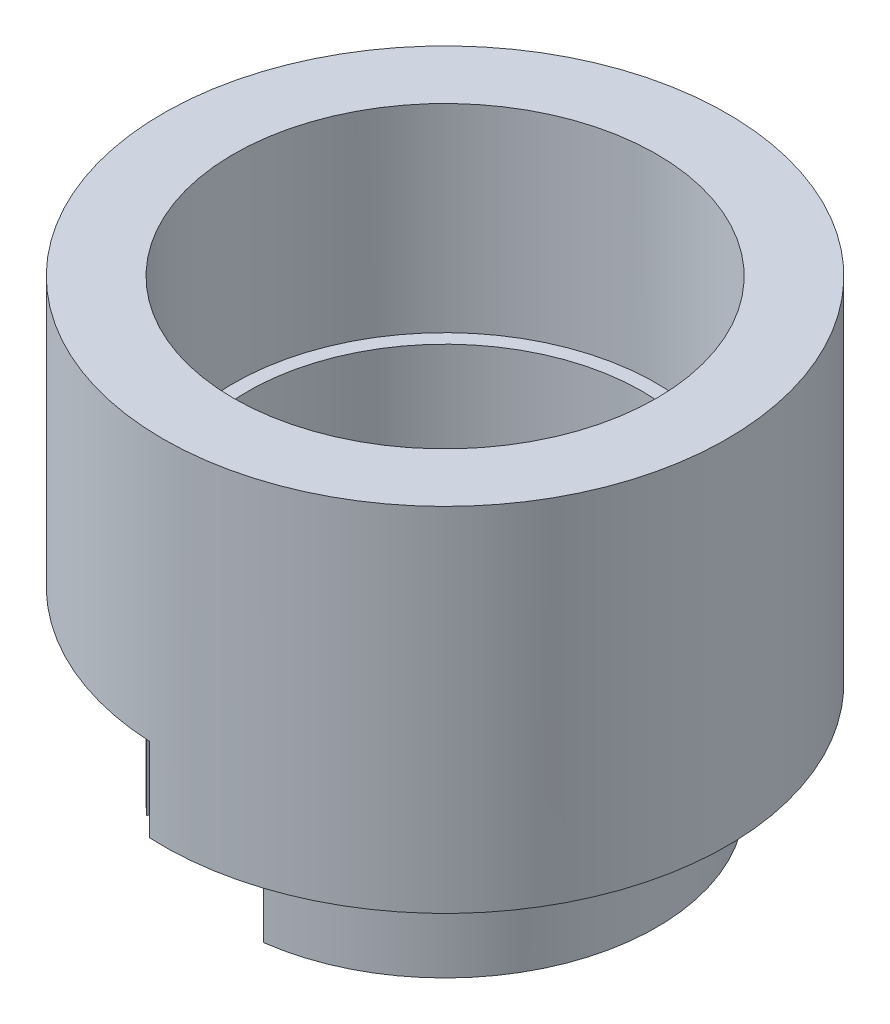
ISO-10303-21;
HEADER;
FILE_DESCRIPTION(('STEP AP214'),'2;1');
FILE_NAME('part.step','',(''),(''),'','','');
FILE_SCHEMA(('AUTOMOTIVE_DESIGN { 1 0 10303 214 1 1 1 1 }'));
ENDSEC;
DATA;
#1=APPLICATION_CONTEXT('core data for automotive mechanical design processes');
#2=APPLICATION_PROTOCOL_DEFINITION('international standard','automotive_design',2000,#1);
#3=PRODUCT_CONTEXT('',#1,'mechanical');
#4=PRODUCT('Part','Part','',(#3));
#5=PRODUCT_RELATED_PRODUCT_CATEGORY('part','',(#4));
#6=PRODUCT_DEFINITION_FORMATION('','',#4);
#7=PRODUCT_DEFINITION_CONTEXT('part definition',#1,'design');
#8=PRODUCT_DEFINITION('design','',#6,#7);
#9=PRODUCT_DEFINITION_SHAPE('','',#8);
#10=(LENGTH_UNIT() NAMED_UNIT(*) SI_UNIT(.MILLI.,.METRE.));
#11=(NAMED_UNIT(*) PLANE_ANGLE_UNIT() SI_UNIT($,.RADIAN.));
#12=(NAMED_UNIT(*) SI_UNIT($,.STERADIAN.) SOLID_ANGLE_UNIT());
#13=UNCERTAINTY_MEASURE_WITH_UNIT(LENGTH_MEASURE(1.E-05),#10,'distance_accuracy_value','');
#14=(GEOMETRIC_REPRESENTATION_CONTEXT(3) GLOBAL_UNCERTAINTY_ASSIGNED_CONTEXT((#13)) GLOBAL_UNIT_ASSIGNED_CONTEXT((#10,
#11,#12)) REPRESENTATION_CONTEXT('',''));
#15=CARTESIAN_POINT('',(0.,0.,0.));
#16=DIRECTION('',(0.,0.,1.));
#17=DIRECTION('',(1.,0.,0.));
#18=AXIS2_PLACEMENT_3D('',#15,#16,#17);
#19=CARTESIAN_POINT('',(0.,0.,0.));
#20=DIRECTION('',(0.,1.,0.));
#21=DIRECTION('',(0.,0.,1.));
#22=AXIS2_PLACEMENT_3D('',#19,#20,#21);
#23=PLANE('',#22);
#24=CARTESIAN_POINT('',(-21.1602690825293,0.,-29.1246117974979));
#25=DIRECTION('',(0.,-1.,0.));
#26=DIRECTION('',(0.,0.,-1.));
#27=AXIS2_PLACEMENT_3D('',#24,#25,#26);
#28=CIRCLE('',#27,1.5);
#29=CARTESIAN_POINT('',(-21.1602690825293,0.,-30.6246117974979));
#30=VERTEX_POINT('',#29);
#31=EDGE_CURVE('E253',#30,#30,#28,.T.);
#32=ORIENTED_EDGE('',*,*,#31,.F.);
#33=EDGE_LOOP('',(#32));
#34=FACE_BOUND('',#33,.T.);
#35=CARTESIAN_POINT('',(-34.2380345866256,0.,-11.1246117974978));
#36=DIRECTION('',(0.,-1.,0.));
#37=DIRECTION('',(0.,0.,-1.));
#38=AXIS2_PLACEMENT_3D('',#35,#36,#37);
#39=CIRCLE('',#38,1.5);
#40=CARTESIAN_POINT('',(-34.2380345866256,0.,-12.6246117974978));
#41=VERTEX_POINT('',#40);
#42=EDGE_CURVE('E236',#41,#41,#39,.T.);
#43=ORIENTED_EDGE('',*,*,#42,.F.);
#44=EDGE_LOOP('',(#43));
#45=FACE_BOUND('',#44,.T.);
#46=CARTESIAN_POINT('',(-34.2380345866254,0.,11.1246117974985));
#47=DIRECTION('',(0.,-1.,0.));
#48=DIRECTION('',(0.,0.,-1.));
#49=AXIS2_PLACEMENT_3D('',#46,#47,#48);
#50=CIRCLE('',#49,1.5);
#51=CARTESIAN_POINT('',(-34.2380345866254,0.,9.62461179749849));
#52=VERTEX_POINT('',#51);
#53=EDGE_CURVE('E207',#52,#52,#50,.T.);
#54=ORIENTED_EDGE('',*,*,#53,.F.);
#55=EDGE_LOOP('',(#54));
#56=FACE_BOUND('',#55,.T.);
#57=DIRECTION('',(-0.819178042205052,0.,0.573539305688021));
#58=VECTOR('',#57,1.);
#59=CARTESIAN_POINT('',(-3.81627640035369,0.,-5.45073336587605));
#60=LINE('',#59,#58);
#61=CARTESIAN_POINT('',(-30.2939246678071,0.,13.0873270082637));
#62=VERTEX_POINT('',#61);
#63=CARTESIAN_POINT('',(-36.126859333869,0.,17.1711978228324));
#64=VERTEX_POINT('',#63);
#65=EDGE_CURVE('E172',#62,#64,#60,.T.);
#66=ORIENTED_EDGE('',*,*,#65,.T.);
#67=CARTESIAN_POINT('',(0.,0.,0.));
#68=DIRECTION('',(0.,1.,0.));
#69=DIRECTION('',(0.,0.,1.));
#70=AXIS2_PLACEMENT_3D('',#67,#68,#69);
#71=CIRCLE('',#70,40.);
#72=CARTESIAN_POINT('',(-19.5058879135128,0.,-34.9216313580204));
#73=VERTEX_POINT('',#72);
#74=EDGE_CURVE('E42',#73,#64,#71,.T.);
#75=ORIENTED_EDGE('',*,*,#74,.F.);
#76=DIRECTION('',(-0.487647197837817,0.,-0.873040783950512));
#77=VECTOR('',#76,1.);
#78=CARTESIAN_POINT('',(-1.40847043936586E-13,0.,0.));
#79=LINE('',#78,#77);
#80=CARTESIAN_POINT('',(-16.0923575286481,0.,-28.8103458703668));
#81=VERTEX_POINT('',#80);
#82=EDGE_CURVE('E199',#81,#73,#79,.T.);
#83=ORIENTED_EDGE('',*,*,#82,.F.);
#84=CARTESIAN_POINT('',(0.,0.,0.));
#85=DIRECTION('',(0.,-1.,0.));
#86=DIRECTION('',(0.,0.,-1.));
#87=AXIS2_PLACEMENT_3D('',#84,#85,#86);
#88=CIRCLE('',#87,33.);
#89=EDGE_CURVE('E196',#62,#81,#88,.T.);
#90=ORIENTED_EDGE('',*,*,#89,.F.);
#91=EDGE_LOOP('',(#66,#75,#83,#90));
#92=FACE_BOUND('',#91,.T.);
#93=ADVANCED_FACE('F33',(#34,#45,#56,#92),#23,.F.);
#94=CARTESIAN_POINT('',(0.,50.,0.));
#95=DIRECTION('',(0.,-1.,0.));
#96=DIRECTION('',(0.,0.,-1.));
#97=AXIS2_PLACEMENT_3D('',#94,#95,#96);
#98=CYLINDRICAL_SURFACE('',#97,40.);
#99=CARTESIAN_POINT('',(0.,50.,0.));
#100=DIRECTION('',(0.,1.,0.));
#101=DIRECTION('',(0.,0.,1.));
#102=AXIS2_PLACEMENT_3D('',#99,#100,#101);
#103=CIRCLE('',#102,40.);
#104=CARTESIAN_POINT('',(0.,50.,40.));
#105=VERTEX_POINT('',#104);
#106=EDGE_CURVE('E11',#105,#105,#103,.T.);
#107=ORIENTED_EDGE('',*,*,#106,.F.);
#108=EDGE_LOOP('',(#107));
#109=FACE_BOUND('',#108,.T.);
#110=DIRECTION('',(0.,-1.,0.));
#111=VECTOR('',#110,1.);
#112=CARTESIAN_POINT('',(-36.126859333869,11.84997677,17.1711978228324));
#113=LINE('',#112,#111);
#114=CARTESIAN_POINT('',(-36.126859333869,11.84997677,17.1711978228324));
#115=VERTEX_POINT('',#114);
#116=EDGE_CURVE('E205',#115,#64,#113,.T.);
#117=ORIENTED_EDGE('',*,*,#116,.F.);
#118=CARTESIAN_POINT('',(0.,11.84997677,0.));
#119=DIRECTION('',(0.,-1.,0.));
#120=DIRECTION('',(0.,0.,-1.));
#121=AXIS2_PLACEMENT_3D('',#118,#119,#120);
#122=CIRCLE('',#121,40.);
#123=CARTESIAN_POINT('',(-1.9505371321681,11.84997677,39.9524142561627));
#124=VERTEX_POINT('',#123);
#125=EDGE_CURVE('E186',#124,#115,#122,.T.);
#126=ORIENTED_EDGE('',*,*,#125,.F.);
#127=DIRECTION('',(0.,-1.,0.));
#128=VECTOR('',#127,1.);
#129=CARTESIAN_POINT('',(-1.9505371321681,11.84997677,39.9524142561627));
#130=LINE('',#129,#128);
#131=CARTESIAN_POINT('',(-1.9505371321681,0.,39.9524142561627));
#132=VERTEX_POINT('',#131);
#133=EDGE_CURVE('E208',#124,#132,#130,.T.);
#134=ORIENTED_EDGE('',*,*,#133,.T.);
#135=CARTESIAN_POINT('',(4.19737007297038,0.,-39.7791664627419));
#136=VERTEX_POINT('',#135);
#137=EDGE_CURVE('E37',#132,#136,#71,.T.);
#138=ORIENTED_EDGE('',*,*,#137,.T.);
#139=DIRECTION('',(0.,-1.,0.));
#140=VECTOR('',#139,1.);
#141=CARTESIAN_POINT('',(4.19737007297038,11.84997677,-39.7791664627419));
#142=LINE('',#141,#140);
#143=CARTESIAN_POINT('',(4.19737007297038,11.84997677,-39.7791664627419));
#144=VERTEX_POINT('',#143);
#145=EDGE_CURVE('E216',#144,#136,#142,.T.);
#146=ORIENTED_EDGE('',*,*,#145,.F.);
#147=CARTESIAN_POINT('',(-19.5058879135128,11.84997677,-34.9216313580204));
#148=VERTEX_POINT('',#147);
#149=EDGE_CURVE('E182',#148,#144,#122,.T.);
#150=ORIENTED_EDGE('',*,*,#149,.F.);
#151=DIRECTION('',(0.,-1.,0.));
#152=VECTOR('',#151,1.);
#153=CARTESIAN_POINT('',(-19.5058879135128,11.84997677,-34.9216313580204));
#154=LINE('',#153,#152);
#155=EDGE_CURVE('E218',#148,#73,#154,.T.);
#156=ORIENTED_EDGE('',*,*,#155,.T.);
#157=ORIENTED_EDGE('',*,*,#74,.T.);
#158=EDGE_LOOP('',(#117,#126,#134,#138,#146,#150,#156,#157));
#159=FACE_BOUND('',#158,.T.);
#160=ADVANCED_FACE('F35',(#109,#159),#98,.T.);
#161=CARTESIAN_POINT('',(0.,50.,0.));
#162=DIRECTION('',(0.,1.,0.));
#163=DIRECTION('',(0.,0.,1.));
#164=AXIS2_PLACEMENT_3D('',#161,#162,#163);
#165=PLANE('',#164);
#166=ORIENTED_EDGE('',*,*,#106,.T.);
#167=EDGE_LOOP('',(#166));
#168=FACE_BOUND('',#167,.T.);
#169=CARTESIAN_POINT('',(0.,50.,0.));
#170=DIRECTION('',(0.,1.,0.));
#171=DIRECTION('',(0.,0.,1.));
#172=AXIS2_PLACEMENT_3D('',#169,#170,#171);
#173=CIRCLE('',#172,30.);
#174=CARTESIAN_POINT('',(0.,50.,30.));
#175=VERTEX_POINT('',#174);
#176=EDGE_CURVE('E261',#175,#175,#173,.T.);
#177=ORIENTED_EDGE('',*,*,#176,.F.);
#178=EDGE_LOOP('',(#177));
#179=FACE_BOUND('',#178,.T.);
#180=ADVANCED_FACE('F296',(#168,#179),#165,.T.);
#181=CARTESIAN_POINT('',(21.1602690825291,0.,29.1246117974981));
#182=DIRECTION('',(0.,-1.,0.));
#183=DIRECTION('',(0.,0.,-1.));
#184=AXIS2_PLACEMENT_3D('',#181,#182,#183);
#185=CIRCLE('',#184,1.5);
#186=CARTESIAN_POINT('',(21.1602690825291,0.,27.6246117974981));
#187=VERTEX_POINT('',#186);
#188=EDGE_CURVE('E229',#187,#187,#185,.T.);
#189=ORIENTED_EDGE('',*,*,#188,.F.);
#190=EDGE_LOOP('',(#189));
#191=FACE_BOUND('',#190,.T.);
#192=CARTESIAN_POINT('',(34.2380345866255,0.,-11.1246117974983));
#193=DIRECTION('',(0.,-1.,0.));
#194=DIRECTION('',(0.,0.,-1.));
#195=AXIS2_PLACEMENT_3D('',#192,#193,#194);
#196=CIRCLE('',#195,1.5);
#197=CARTESIAN_POINT('',(34.2380345866255,0.,-12.6246117974983));
#198=VERTEX_POINT('',#197);
#199=EDGE_CURVE('E247',#198,#198,#196,.T.);
#200=ORIENTED_EDGE('',*,*,#199,.F.);
#201=EDGE_LOOP('',(#200));
#202=FACE_BOUND('',#201,.T.);
#203=CARTESIAN_POINT('',(34.2380345866256,0.,11.124611797498));
#204=DIRECTION('',(0.,-1.,0.));
#205=DIRECTION('',(0.,0.,-1.));
#206=AXIS2_PLACEMENT_3D('',#203,#204,#205);
#207=CIRCLE('',#206,1.5);
#208=CARTESIAN_POINT('',(34.2380345866256,0.,9.62461179749802));
#209=VERTEX_POINT('',#208);
#210=EDGE_CURVE('E241',#209,#209,#207,.T.);
#211=ORIENTED_EDGE('',*,*,#210,.F.);
#212=EDGE_LOOP('',(#211));
#213=FACE_BOUND('',#212,.T.);
#214=ORIENTED_EDGE('',*,*,#137,.F.);
#215=DIRECTION('',(-0.0487634283041756,0.,0.998810356404069));
#216=VECTOR('',#215,1.);
#217=CARTESIAN_POINT('',(-1.07793096146607E-12,0.,0.));
#218=LINE('',#217,#216);
#219=CARTESIAN_POINT('',(-1.46290284912635,0.,29.964310692122));
#220=VERTEX_POINT('',#219);
#221=EDGE_CURVE('E176',#220,#132,#218,.T.);
#222=ORIENTED_EDGE('',*,*,#221,.F.);
#223=CARTESIAN_POINT('',(0.,0.,0.));
#224=DIRECTION('',(0.,1.,0.));
#225=DIRECTION('',(0.,0.,1.));
#226=AXIS2_PLACEMENT_3D('',#223,#224,#225);
#227=CIRCLE('',#226,30.);
#228=CARTESIAN_POINT('',(4.00883862894171,0.,29.7309470560072));
#229=VERTEX_POINT('',#228);
#230=EDGE_CURVE('E228',#220,#229,#227,.T.);
#231=ORIENTED_EDGE('',*,*,#230,.T.);
#232=CARTESIAN_POINT('',(0.,0.,0.));
#233=DIRECTION('',(0.,1.,0.));
#234=DIRECTION('',(0.,0.,1.));
#235=AXIS2_PLACEMENT_3D('',#232,#233,#234);
#236=CIRCLE('',#235,30.);
#237=CARTESIAN_POINT('',(3.14802755472722,0.,-29.8343748470565));
#238=VERTEX_POINT('',#237);
#239=EDGE_CURVE('E166',#229,#238,#236,.T.);
#240=ORIENTED_EDGE('',*,*,#239,.T.);
#241=DIRECTION('',(0.104934251824316,0.,-0.994479161568542));
#242=VECTOR('',#241,1.);
#243=CARTESIAN_POINT('',(-2.26511715484874E-12,0.,-2.39007897926772E-13));
#244=LINE('',#243,#242);
#245=EDGE_CURVE('E201',#238,#136,#244,.T.);
#246=ORIENTED_EDGE('',*,*,#245,.T.);
#247=EDGE_LOOP('',(#214,#222,#231,#240,#246));
#248=FACE_BOUND('',#247,.T.);
#249=ADVANCED_FACE('F270',(#191,#202,#213,#248),#23,.F.);
#250=CARTESIAN_POINT('',(0.,50.,0.));
#251=DIRECTION('',(0.,-1.,0.));
#252=DIRECTION('',(0.,0.,-1.));
#253=AXIS2_PLACEMENT_3D('',#250,#251,#252);
#254=CYLINDRICAL_SURFACE('',#253,30.);
#255=DIRECTION('',(0.,-1.,0.));
#256=VECTOR('',#255,1.);
#257=CARTESIAN_POINT('',(4.0088386289417,21.84997677,29.7309470560072));
#258=LINE('',#257,#256);
#259=CARTESIAN_POINT('',(4.00883862894171,21.84997677,29.7309470560072));
#260=VERTEX_POINT('',#259);
#261=EDGE_CURVE('E167',#260,#229,#258,.T.);
#262=ORIENTED_EDGE('',*,*,#261,.T.);
#263=ORIENTED_EDGE('',*,*,#230,.F.);
#264=DIRECTION('',(0.,-1.,0.));
#265=VECTOR('',#264,1.);
#266=CARTESIAN_POINT('',(-1.46290284912635,11.84997677,29.964310692122));
#267=LINE('',#266,#265);
#268=CARTESIAN_POINT('',(-1.46290284912635,11.84997677,29.964310692122));
#269=VERTEX_POINT('',#268);
#270=EDGE_CURVE('E211',#269,#220,#267,.T.);
#271=ORIENTED_EDGE('',*,*,#270,.F.);
#272=CARTESIAN_POINT('',(0.,11.84997677,0.));
#273=DIRECTION('',(0.,-1.,0.));
#274=DIRECTION('',(0.,0.,-1.));
#275=AXIS2_PLACEMENT_3D('',#272,#273,#274);
#276=CIRCLE('',#275,30.);
#277=CARTESIAN_POINT('',(-19.9092408020485,11.84997677,22.441526924121));
#278=VERTEX_POINT('',#277);
#279=EDGE_CURVE('E189',#269,#278,#276,.T.);
#280=ORIENTED_EDGE('',*,*,#279,.T.);
#281=DIRECTION('',(0.,-1.,0.));
#282=VECTOR('',#281,1.);
#283=CARTESIAN_POINT('',(-19.9092408020485,21.84997677,22.441526924121));
#284=LINE('',#283,#282);
#285=CARTESIAN_POINT('',(-19.9092408020485,21.84997677,22.441526924121));
#286=VERTEX_POINT('',#285);
#287=EDGE_CURVE('E54',#286,#278,#284,.T.);
#288=ORIENTED_EDGE('',*,*,#287,.F.);
#289=CARTESIAN_POINT('',(0.,21.84997677,0.));
#290=DIRECTION('',(0.,-1.,0.));
#291=DIRECTION('',(0.,0.,-1.));
#292=AXIS2_PLACEMENT_3D('',#289,#290,#291);
#293=CIRCLE('',#292,30.);
#294=EDGE_CURVE('E49',#286,#260,#293,.T.);
#295=ORIENTED_EDGE('',*,*,#294,.T.);
#296=EDGE_LOOP('',(#262,#263,#271,#280,#288,#295));
#297=FACE_BOUND('',#296,.T.);
#298=ORIENTED_EDGE('',*,*,#176,.T.);
#299=EDGE_LOOP('',(#298));
#300=FACE_BOUND('',#299,.T.);
#301=ADVANCED_FACE('F302',(#297,#300),#254,.F.);
#302=CARTESIAN_POINT('',(34.2380345866256,6.,11.124611797498));
#303=DIRECTION('',(0.,-1.,0.));
#304=DIRECTION('',(0.,0.,-1.));
#305=AXIS2_PLACEMENT_3D('',#302,#303,#304);
#306=CYLINDRICAL_SURFACE('',#305,1.5);
#307=CARTESIAN_POINT('',(34.2380345866256,6.,11.124611797498));
#308=DIRECTION('',(0.,-1.,0.));
#309=DIRECTION('',(0.,0.,-1.));
#310=AXIS2_PLACEMENT_3D('',#307,#308,#309);
#311=CIRCLE('',#310,1.5);
#312=CARTESIAN_POINT('',(34.2380345866256,6.,9.62461179749802));
#313=VERTEX_POINT('',#312);
#314=EDGE_CURVE('E232',#313,#313,#311,.T.);
#315=ORIENTED_EDGE('',*,*,#314,.F.);
#316=EDGE_LOOP('',(#315));
#317=FACE_BOUND('',#316,.T.);
#318=ORIENTED_EDGE('',*,*,#210,.T.);
#319=EDGE_LOOP('',(#318));
#320=FACE_BOUND('',#319,.T.);
#321=ADVANCED_FACE('F308',(#317,#320),#306,.F.);
#322=CARTESIAN_POINT('',(34.2380345866256,6.,11.124611797498));
#323=DIRECTION('',(0.,-1.,0.));
#324=DIRECTION('',(0.,0.,-1.));
#325=AXIS2_PLACEMENT_3D('',#322,#323,#324);
#326=PLANE('',#325);
#327=ORIENTED_EDGE('',*,*,#314,.T.);
#328=EDGE_LOOP('',(#327));
#329=FACE_BOUND('',#328,.T.);
#330=ADVANCED_FACE('F318',(#329),#326,.T.);
#331=CARTESIAN_POINT('',(34.2380345866255,6.,-11.1246117974983));
#332=DIRECTION('',(0.,-1.,0.));
#333=DIRECTION('',(0.,0.,-1.));
#334=AXIS2_PLACEMENT_3D('',#331,#332,#333);
#335=CYLINDRICAL_SURFACE('',#334,1.5);
#336=CARTESIAN_POINT('',(34.2380345866255,6.,-11.1246117974983));
#337=DIRECTION('',(0.,-1.,0.));
#338=DIRECTION('',(0.,0.,-1.));
#339=AXIS2_PLACEMENT_3D('',#336,#337,#338);
#340=CIRCLE('',#339,1.5);
#341=CARTESIAN_POINT('',(34.2380345866255,6.,-12.6246117974983));
#342=VERTEX_POINT('',#341);
#343=EDGE_CURVE('E244',#342,#342,#340,.T.);
#344=ORIENTED_EDGE('',*,*,#343,.F.);
#345=EDGE_LOOP('',(#344));
#346=FACE_BOUND('',#345,.T.);
#347=ORIENTED_EDGE('',*,*,#199,.T.);
#348=EDGE_LOOP('',(#347));
#349=FACE_BOUND('',#348,.T.);
#350=ADVANCED_FACE('F324',(#346,#349),#335,.F.);
#351=CARTESIAN_POINT('',(34.2380345866255,6.,-11.1246117974983));
#352=DIRECTION('',(0.,-1.,0.));
#353=DIRECTION('',(0.,0.,-1.));
#354=AXIS2_PLACEMENT_3D('',#351,#352,#353);
#355=PLANE('',#354);
#356=ORIENTED_EDGE('',*,*,#343,.T.);
#357=EDGE_LOOP('',(#356));
#358=FACE_BOUND('',#357,.T.);
#359=ADVANCED_FACE('F330',(#358),#355,.T.);
#360=CARTESIAN_POINT('',(-21.1602690825293,6.,-29.1246117974979));
#361=DIRECTION('',(0.,-1.,0.));
#362=DIRECTION('',(0.,0.,-1.));
#363=AXIS2_PLACEMENT_3D('',#360,#361,#362);
#364=CYLINDRICAL_SURFACE('',#363,1.5);
#365=CARTESIAN_POINT('',(-21.1602690825293,6.,-29.1246117974979));
#366=DIRECTION('',(0.,-1.,0.));
#367=DIRECTION('',(0.,0.,-1.));
#368=AXIS2_PLACEMENT_3D('',#365,#366,#367);
#369=CIRCLE('',#368,1.5);
#370=CARTESIAN_POINT('',(-21.1602690825293,6.,-30.6246117974979));
#371=VERTEX_POINT('',#370);
#372=EDGE_CURVE('E250',#371,#371,#369,.T.);
#373=ORIENTED_EDGE('',*,*,#372,.F.);
#374=EDGE_LOOP('',(#373));
#375=FACE_BOUND('',#374,.T.);
#376=ORIENTED_EDGE('',*,*,#31,.T.);
#377=EDGE_LOOP('',(#376));
#378=FACE_BOUND('',#377,.T.);
#379=ADVANCED_FACE('F333',(#375,#378),#364,.F.);
#380=CARTESIAN_POINT('',(-21.1602690825293,6.,-29.1246117974979));
#381=DIRECTION('',(0.,-1.,0.));
#382=DIRECTION('',(0.,0.,-1.));
#383=AXIS2_PLACEMENT_3D('',#380,#381,#382);
#384=PLANE('',#383);
#385=ORIENTED_EDGE('',*,*,#372,.T.);
#386=EDGE_LOOP('',(#385));
#387=FACE_BOUND('',#386,.T.);
#388=ADVANCED_FACE('F338',(#387),#384,.T.);
#389=CARTESIAN_POINT('',(-34.2380345866256,6.,-11.1246117974978));
#390=DIRECTION('',(0.,-1.,0.));
#391=DIRECTION('',(0.,0.,-1.));
#392=AXIS2_PLACEMENT_3D('',#389,#390,#391);
#393=CYLINDRICAL_SURFACE('',#392,1.5);
#394=CARTESIAN_POINT('',(-34.2380345866256,6.,-11.1246117974978));
#395=DIRECTION('',(0.,-1.,0.));
#396=DIRECTION('',(0.,0.,-1.));
#397=AXIS2_PLACEMENT_3D('',#394,#395,#396);
#398=CIRCLE('',#397,1.5);
#399=CARTESIAN_POINT('',(-34.2380345866256,6.,-12.6246117974978));
#400=VERTEX_POINT('',#399);
#401=EDGE_CURVE('E256',#400,#400,#398,.T.);
#402=ORIENTED_EDGE('',*,*,#401,.F.);
#403=EDGE_LOOP('',(#402));
#404=FACE_BOUND('',#403,.T.);
#405=ORIENTED_EDGE('',*,*,#42,.T.);
#406=EDGE_LOOP('',(#405));
#407=FACE_BOUND('',#406,.T.);
#408=ADVANCED_FACE('F341',(#404,#407),#393,.F.);
#409=CARTESIAN_POINT('',(-34.2380345866256,6.,-11.1246117974978));
#410=DIRECTION('',(0.,-1.,0.));
#411=DIRECTION('',(0.,0.,-1.));
#412=AXIS2_PLACEMENT_3D('',#409,#410,#411);
#413=PLANE('',#412);
#414=ORIENTED_EDGE('',*,*,#401,.T.);
#415=EDGE_LOOP('',(#414));
#416=FACE_BOUND('',#415,.T.);
#417=ADVANCED_FACE('F346',(#416),#413,.T.);
#418=CARTESIAN_POINT('',(-34.2380345866254,6.,11.1246117974985));
#419=DIRECTION('',(0.,-1.,0.));
#420=DIRECTION('',(0.,0.,-1.));
#421=AXIS2_PLACEMENT_3D('',#418,#419,#420);
#422=CYLINDRICAL_SURFACE('',#421,1.5);
#423=CARTESIAN_POINT('',(-34.2380345866254,6.,11.1246117974985));
#424=DIRECTION('',(0.,-1.,0.));
#425=DIRECTION('',(0.,0.,-1.));
#426=AXIS2_PLACEMENT_3D('',#423,#424,#425);
#427=CIRCLE('',#426,1.5);
#428=CARTESIAN_POINT('',(-34.2380345866254,6.,9.62461179749849));
#429=VERTEX_POINT('',#428);
#430=EDGE_CURVE('E233',#429,#429,#427,.T.);
#431=ORIENTED_EDGE('',*,*,#430,.F.);
#432=EDGE_LOOP('',(#431));
#433=FACE_BOUND('',#432,.T.);
#434=ORIENTED_EDGE('',*,*,#53,.T.);
#435=EDGE_LOOP('',(#434));
#436=FACE_BOUND('',#435,.T.);
#437=ADVANCED_FACE('F349',(#433,#436),#422,.F.);
#438=CARTESIAN_POINT('',(-34.2380345866254,6.,11.1246117974985));
#439=DIRECTION('',(0.,-1.,0.));
#440=DIRECTION('',(0.,0.,-1.));
#441=AXIS2_PLACEMENT_3D('',#438,#439,#440);
#442=PLANE('',#441);
#443=ORIENTED_EDGE('',*,*,#430,.T.);
#444=EDGE_LOOP('',(#443));
#445=FACE_BOUND('',#444,.T.);
#446=ADVANCED_FACE('F415',(#445),#442,.T.);
#447=CARTESIAN_POINT('',(21.1602690825291,6.,29.1246117974981));
#448=DIRECTION('',(0.,-1.,0.));
#449=DIRECTION('',(0.,0.,-1.));
#450=AXIS2_PLACEMENT_3D('',#447,#448,#449);
#451=CYLINDRICAL_SURFACE('',#450,1.5);
#452=CARTESIAN_POINT('',(21.1602690825291,6.,29.1246117974981));
#453=DIRECTION('',(0.,-1.,0.));
#454=DIRECTION('',(0.,0.,-1.));
#455=AXIS2_PLACEMENT_3D('',#452,#453,#454);
#456=CIRCLE('',#455,1.5);
#457=CARTESIAN_POINT('',(21.1602690825291,6.,27.6246117974981));
#458=VERTEX_POINT('',#457);
#459=EDGE_CURVE('E225',#458,#458,#456,.T.);
#460=ORIENTED_EDGE('',*,*,#459,.F.);
#461=EDGE_LOOP('',(#460));
#462=FACE_BOUND('',#461,.T.);
#463=ORIENTED_EDGE('',*,*,#188,.T.);
#464=EDGE_LOOP('',(#463));
#465=FACE_BOUND('',#464,.T.);
#466=ADVANCED_FACE('F411',(#462,#465),#451,.F.);
#467=CARTESIAN_POINT('',(21.1602690825291,6.,29.1246117974981));
#468=DIRECTION('',(0.,-1.,0.));
#469=DIRECTION('',(0.,0.,-1.));
#470=AXIS2_PLACEMENT_3D('',#467,#468,#469);
#471=PLANE('',#470);
#472=ORIENTED_EDGE('',*,*,#459,.T.);
#473=EDGE_LOOP('',(#472));
#474=FACE_BOUND('',#473,.T.);
#475=ADVANCED_FACE('F400',(#474),#471,.T.);
#476=CARTESIAN_POINT('',(-3.81627640035369,11.84997677,-5.45073336587605));
#477=DIRECTION('',(0.573539305688021,0.,0.819178042205052));
#478=DIRECTION('',(0.819178042205053,0.,-0.573539305688021));
#479=AXIS2_PLACEMENT_3D('',#476,#477,#478);
#480=PLANE('',#479);
#481=ORIENTED_EDGE('',*,*,#65,.F.);
#482=DIRECTION('',(0.,-1.,0.));
#483=VECTOR('',#482,1.);
#484=CARTESIAN_POINT('',(-30.2939246678071,11.84997677,13.0873270082637));
#485=LINE('',#484,#483);
#486=CARTESIAN_POINT('',(-30.2939246678071,11.84997677,13.0873270082637));
#487=VERTEX_POINT('',#486);
#488=EDGE_CURVE('E223',#487,#62,#485,.T.);
#489=ORIENTED_EDGE('',*,*,#488,.F.);
#490=DIRECTION('',(-0.819178042205052,0.,0.573539305688021));
#491=VECTOR('',#490,1.);
#492=CARTESIAN_POINT('',(-3.81627640035369,11.84997677,-5.45073336587605));
#493=LINE('',#492,#491);
#494=EDGE_CURVE('E173',#487,#115,#493,.T.);
#495=ORIENTED_EDGE('',*,*,#494,.T.);
#496=ORIENTED_EDGE('',*,*,#116,.T.);
#497=EDGE_LOOP('',(#481,#489,#495,#496));
#498=FACE_BOUND('',#497,.T.);
#499=ADVANCED_FACE('F385',(#498),#480,.T.);
#500=CARTESIAN_POINT('',(-1.07793096146607E-12,11.84997677,0.));
#501=DIRECTION('',(0.998810356404069,0.,0.0487634283041756));
#502=DIRECTION('',(0.0487634283041756,0.,-0.998810356404069));
#503=AXIS2_PLACEMENT_3D('',#500,#501,#502);
#504=PLANE('',#503);
#505=ORIENTED_EDGE('',*,*,#221,.T.);
#506=ORIENTED_EDGE('',*,*,#133,.F.);
#507=DIRECTION('',(-0.0487634283041756,0.,0.998810356404069));
#508=VECTOR('',#507,1.);
#509=CARTESIAN_POINT('',(-1.07793096146607E-12,11.84997677,0.));
#510=LINE('',#509,#508);
#511=EDGE_CURVE('E191',#269,#124,#510,.T.);
#512=ORIENTED_EDGE('',*,*,#511,.F.);
#513=ORIENTED_EDGE('',*,*,#270,.T.);
#514=EDGE_LOOP('',(#505,#506,#512,#513));
#515=FACE_BOUND('',#514,.T.);
#516=ADVANCED_FACE('F389',(#515),#504,.F.);
#517=CARTESIAN_POINT('',(-2.26511715484874E-12,11.84997677,-2.39007897926772E-13));
#518=DIRECTION('',(-0.994479161568543,0.,-0.104934251824316));
#519=DIRECTION('',(-0.104934251824316,0.,0.994479161568543));
#520=AXIS2_PLACEMENT_3D('',#517,#518,#519);
#521=PLANE('',#520);
#522=ORIENTED_EDGE('',*,*,#245,.F.);
#523=DIRECTION('',(0.,-1.,0.));
#524=VECTOR('',#523,1.);
#525=CARTESIAN_POINT('',(3.14802755472722,11.84997677,-29.8343748470565));
#526=LINE('',#525,#524);
#527=CARTESIAN_POINT('',(3.14802755472722,11.84997677,-29.8343748470565));
#528=VERTEX_POINT('',#527);
#529=EDGE_CURVE('E213',#528,#238,#526,.T.);
#530=ORIENTED_EDGE('',*,*,#529,.F.);
#531=DIRECTION('',(0.104934251824316,0.,-0.994479161568542));
#532=VECTOR('',#531,1.);
#533=CARTESIAN_POINT('',(-2.26511715484874E-12,11.84997677,-2.39007897926772E-13));
#534=LINE('',#533,#532);
#535=EDGE_CURVE('E185',#528,#144,#534,.T.);
#536=ORIENTED_EDGE('',*,*,#535,.T.);
#537=ORIENTED_EDGE('',*,*,#145,.T.);
#538=EDGE_LOOP('',(#522,#530,#536,#537));
#539=FACE_BOUND('',#538,.T.);
#540=ADVANCED_FACE('F374',(#539),#521,.T.);
#541=CARTESIAN_POINT('',(-1.40847043936586E-13,11.84997677,0.));
#542=DIRECTION('',(-0.873040783950512,0.,0.487647197837817));
#543=DIRECTION('',(0.487647197837817,0.,0.873040783950512));
#544=AXIS2_PLACEMENT_3D('',#541,#542,#543);
#545=PLANE('',#544);
#546=ORIENTED_EDGE('',*,*,#82,.T.);
#547=ORIENTED_EDGE('',*,*,#155,.F.);
#548=DIRECTION('',(-0.487647197837817,0.,-0.873040783950512));
#549=VECTOR('',#548,1.);
#550=CARTESIAN_POINT('',(-1.40847043936586E-13,11.84997677,0.));
#551=LINE('',#550,#549);
#552=CARTESIAN_POINT('',(-16.0923575286481,11.84997677,-28.8103458703668));
#553=VERTEX_POINT('',#552);
#554=EDGE_CURVE('E179',#553,#148,#551,.T.);
#555=ORIENTED_EDGE('',*,*,#554,.F.);
#556=DIRECTION('',(0.,-1.,0.));
#557=VECTOR('',#556,1.);
#558=CARTESIAN_POINT('',(-16.0923575286481,11.84997677,-28.8103458703668));
#559=LINE('',#558,#557);
#560=EDGE_CURVE('E221',#553,#81,#559,.T.);
#561=ORIENTED_EDGE('',*,*,#560,.T.);
#562=EDGE_LOOP('',(#546,#547,#555,#561));
#563=FACE_BOUND('',#562,.T.);
#564=ADVANCED_FACE('F382',(#563),#545,.F.);
#565=CARTESIAN_POINT('',(0.,11.84997677,0.));
#566=DIRECTION('',(0.,-1.,0.));
#567=DIRECTION('',(0.,0.,-1.));
#568=AXIS2_PLACEMENT_3D('',#565,#566,#567);
#569=CYLINDRICAL_SURFACE('',#568,33.);
#570=ORIENTED_EDGE('',*,*,#89,.T.);
#571=ORIENTED_EDGE('',*,*,#560,.F.);
#572=CARTESIAN_POINT('',(0.,11.84997677,0.));
#573=DIRECTION('',(0.,-1.,0.));
#574=DIRECTION('',(0.,0.,-1.));
#575=AXIS2_PLACEMENT_3D('',#572,#573,#574);
#576=CIRCLE('',#575,33.);
#577=EDGE_CURVE('E175',#487,#553,#576,.T.);
#578=ORIENTED_EDGE('',*,*,#577,.F.);
#579=ORIENTED_EDGE('',*,*,#488,.T.);
#580=EDGE_LOOP('',(#570,#571,#578,#579));
#581=FACE_BOUND('',#580,.T.);
#582=ADVANCED_FACE('F384',(#581),#569,.F.);
#583=CARTESIAN_POINT('',(0.,11.84997677,0.));
#584=DIRECTION('',(0.,-1.,0.));
#585=DIRECTION('',(0.,0.,-1.));
#586=AXIS2_PLACEMENT_3D('',#583,#584,#585);
#587=PLANE('',#586);
#588=ORIENTED_EDGE('',*,*,#494,.F.);
#589=ORIENTED_EDGE('',*,*,#577,.T.);
#590=ORIENTED_EDGE('',*,*,#554,.T.);
#591=ORIENTED_EDGE('',*,*,#149,.T.);
#592=ORIENTED_EDGE('',*,*,#535,.F.);
#593=EDGE_CURVE('E188',#278,#528,#276,.T.);
#594=ORIENTED_EDGE('',*,*,#593,.F.);
#595=ORIENTED_EDGE('',*,*,#279,.F.);
#596=ORIENTED_EDGE('',*,*,#511,.T.);
#597=ORIENTED_EDGE('',*,*,#125,.T.);
#598=EDGE_LOOP('',(#588,#589,#590,#591,#592,#594,#595,#596,#597));
#599=FACE_BOUND('',#598,.T.);
#600=ADVANCED_FACE('F378',(#599),#587,.T.);
#601=CARTESIAN_POINT('',(0.,21.84997677,0.));
#602=DIRECTION('',(0.,-1.,0.));
#603=DIRECTION('',(0.,0.,-1.));
#604=AXIS2_PLACEMENT_3D('',#601,#602,#603);
#605=CYLINDRICAL_SURFACE('',#604,30.);
#606=ORIENTED_EDGE('',*,*,#239,.F.);
#607=CARTESIAN_POINT('',(4.0088386289417,-15.,29.7309470560072));
#608=VERTEX_POINT('',#607);
#609=EDGE_CURVE('E169',#229,#608,#258,.T.);
#610=ORIENTED_EDGE('',*,*,#609,.T.);
#611=CARTESIAN_POINT('',(0.,-15.,0.));
#612=DIRECTION('',(0.,-1.,0.));
#613=DIRECTION('',(0.,0.,-1.));
#614=AXIS2_PLACEMENT_3D('',#611,#612,#613);
#615=CIRCLE('',#614,30.);
#616=CARTESIAN_POINT('',(-19.9092408020485,-15.,22.441526924121));
#617=VERTEX_POINT('',#616);
#618=EDGE_CURVE('E148',#617,#608,#615,.T.);
#619=ORIENTED_EDGE('',*,*,#618,.F.);
#620=EDGE_CURVE('E138',#278,#617,#284,.T.);
#621=ORIENTED_EDGE('',*,*,#620,.F.);
#622=ORIENTED_EDGE('',*,*,#593,.T.);
#623=ORIENTED_EDGE('',*,*,#529,.T.);
#624=EDGE_LOOP('',(#606,#610,#619,#621,#622,#623));
#625=FACE_BOUND('',#624,.T.);
#626=ADVANCED_FACE('F275',(#625),#605,.T.);
#627=CARTESIAN_POINT('',(0.,21.84997677,0.));
#628=DIRECTION('',(0.,-1.,0.));
#629=DIRECTION('',(0.,0.,-1.));
#630=AXIS2_PLACEMENT_3D('',#627,#628,#629);
#631=CYLINDRICAL_SURFACE('',#630,28.);
#632=DIRECTION('',(0.,-1.,0.));
#633=VECTOR('',#632,1.);
#634=CARTESIAN_POINT('',(-19.230258498937,21.84997677,20.3518342678016));
#635=LINE('',#634,#633);
#636=CARTESIAN_POINT('',(-19.230258498937,21.84997677,20.3518342678016));
#637=VERTEX_POINT('',#636);
#638=CARTESIAN_POINT('',(-19.230258498937,-15.,20.3518342678016));
#639=VERTEX_POINT('',#638);
#640=EDGE_CURVE('E128',#637,#639,#635,.T.);
#641=ORIENTED_EDGE('',*,*,#640,.T.);
#642=CARTESIAN_POINT('',(0.,-15.,0.));
#643=DIRECTION('',(0.,1.,0.));
#644=DIRECTION('',(0.,0.,-1.));
#645=AXIS2_PLACEMENT_3D('',#642,#643,#644);
#646=CIRCLE('',#645,28.);
#647=CARTESIAN_POINT('',(4.70036246264258,-15.,27.602655537462));
#648=VERTEX_POINT('',#647);
#649=EDGE_CURVE('E132',#648,#639,#646,.T.);
#650=ORIENTED_EDGE('',*,*,#649,.F.);
#651=DIRECTION('',(0.,-1.,0.));
#652=VECTOR('',#651,1.);
#653=CARTESIAN_POINT('',(4.70036246264258,21.84997677,27.602655537462));
#654=LINE('',#653,#652);
#655=CARTESIAN_POINT('',(4.70036246264258,21.84997677,27.602655537462));
#656=VERTEX_POINT('',#655);
#657=EDGE_CURVE('E164',#656,#648,#654,.T.);
#658=ORIENTED_EDGE('',*,*,#657,.F.);
#659=CARTESIAN_POINT('',(0.,21.84997677,0.));
#660=DIRECTION('',(0.,1.,0.));
#661=DIRECTION('',(0.,0.,-1.));
#662=AXIS2_PLACEMENT_3D('',#659,#660,#661);
#663=CIRCLE('',#662,28.);
#664=EDGE_CURVE('E134',#656,#637,#663,.T.);
#665=ORIENTED_EDGE('',*,*,#664,.T.);
#666=EDGE_LOOP('',(#641,#650,#658,#665));
#667=FACE_BOUND('',#666,.T.);
#668=ADVANCED_FACE('F130',(#667),#631,.F.);
#669=CARTESIAN_POINT('',(4.00883862894171,21.84997677,29.7309470560072));
#670=DIRECTION('',(-0.951056516295143,0.,-0.309016994374979));
#671=DIRECTION('',(-0.309016994374979,0.,0.951056516295143));
#672=AXIS2_PLACEMENT_3D('',#669,#670,#671);
#673=PLANE('',#672);
#674=ORIENTED_EDGE('',*,*,#657,.T.);
#675=DIRECTION('',(0.309016994374979,0.,-0.951056516295143));
#676=VECTOR('',#675,1.);
#677=CARTESIAN_POINT('',(4.00883862894171,-15.,29.7309470560072));
#678=LINE('',#677,#676);
#679=EDGE_CURVE('E153',#608,#648,#678,.T.);
#680=ORIENTED_EDGE('',*,*,#679,.F.);
#681=ORIENTED_EDGE('',*,*,#609,.F.);
#682=ORIENTED_EDGE('',*,*,#261,.F.);
#683=DIRECTION('',(0.309016994374979,0.,-0.951056516295143));
#684=VECTOR('',#683,1.);
#685=CARTESIAN_POINT('',(4.00883862894171,21.84997677,29.7309470560072));
#686=LINE('',#685,#684);
#687=EDGE_CURVE('E139',#260,#656,#686,.T.);
#688=ORIENTED_EDGE('',*,*,#687,.T.);
#689=EDGE_LOOP('',(#674,#680,#681,#682,#688));
#690=FACE_BOUND('',#689,.T.);
#691=ADVANCED_FACE('F278',(#690),#673,.T.);
#692=CARTESIAN_POINT('',(-19.9092408020485,21.84997677,22.441526924121));
#693=DIRECTION('',(0.951056516295143,0.,0.309016994374979));
#694=DIRECTION('',(0.309016994374979,0.,-0.951056516295143));
#695=AXIS2_PLACEMENT_3D('',#692,#693,#694);
#696=PLANE('',#695);
#697=ORIENTED_EDGE('',*,*,#287,.T.);
#698=ORIENTED_EDGE('',*,*,#620,.T.);
#699=DIRECTION('',(-0.309016994374979,0.,0.951056516295143));
#700=VECTOR('',#699,1.);
#701=CARTESIAN_POINT('',(-19.9092408020485,-15.,22.441526924121));
#702=LINE('',#701,#700);
#703=EDGE_CURVE('E142',#639,#617,#702,.T.);
#704=ORIENTED_EDGE('',*,*,#703,.F.);
#705=ORIENTED_EDGE('',*,*,#640,.F.);
#706=DIRECTION('',(-0.309016994374979,0.,0.951056516295143));
#707=VECTOR('',#706,1.);
#708=CARTESIAN_POINT('',(-19.9092408020485,21.84997677,22.441526924121));
#709=LINE('',#708,#707);
#710=EDGE_CURVE('E159',#637,#286,#709,.T.);
#711=ORIENTED_EDGE('',*,*,#710,.T.);
#712=EDGE_LOOP('',(#697,#698,#704,#705,#711));
#713=FACE_BOUND('',#712,.T.);
#714=ADVANCED_FACE('F143',(#713),#696,.T.);
#715=CARTESIAN_POINT('',(0.,21.84997677,0.));
#716=DIRECTION('',(0.,-1.,0.));
#717=DIRECTION('',(0.,0.,-1.));
#718=AXIS2_PLACEMENT_3D('',#715,#716,#717);
#719=PLANE('',#718);
#720=ORIENTED_EDGE('',*,*,#664,.F.);
#721=ORIENTED_EDGE('',*,*,#687,.F.);
#722=ORIENTED_EDGE('',*,*,#294,.F.);
#723=ORIENTED_EDGE('',*,*,#710,.F.);
#724=EDGE_LOOP('',(#720,#721,#722,#723));
#725=FACE_BOUND('',#724,.T.);
#726=ADVANCED_FACE('F281',(#725),#719,.F.);
#727=CARTESIAN_POINT('',(0.,-15.,0.));
#728=DIRECTION('',(0.,-1.,0.));
#729=DIRECTION('',(0.,0.,-1.));
#730=AXIS2_PLACEMENT_3D('',#727,#728,#729);
#731=PLANE('',#730);
#732=ORIENTED_EDGE('',*,*,#649,.T.);
#733=ORIENTED_EDGE('',*,*,#703,.T.);
#734=ORIENTED_EDGE('',*,*,#618,.T.);
#735=ORIENTED_EDGE('',*,*,#679,.T.);
#736=EDGE_LOOP('',(#732,#733,#734,#735));
#737=FACE_BOUND('',#736,.T.);
#738=ADVANCED_FACE('F151',(#737),#731,.T.);
#739=CLOSED_SHELL('',(#93,#160,#180,#249,#301,#321,#330,#350,#359,#379,#388,#408,#417,#437,#446,
#466,#475,#499,#516,#540,#564,#582,#600,#626,#668,#691,#714,#726,#738));
#740=MANIFOLD_SOLID_BREP('B2',#739);
#741=ADVANCED_BREP_SHAPE_REPRESENTATION('',(#18,#740),#14);
#742=SHAPE_DEFINITION_REPRESENTATION(#9,#741);
ENDSEC;
END-ISO-10303-21;
